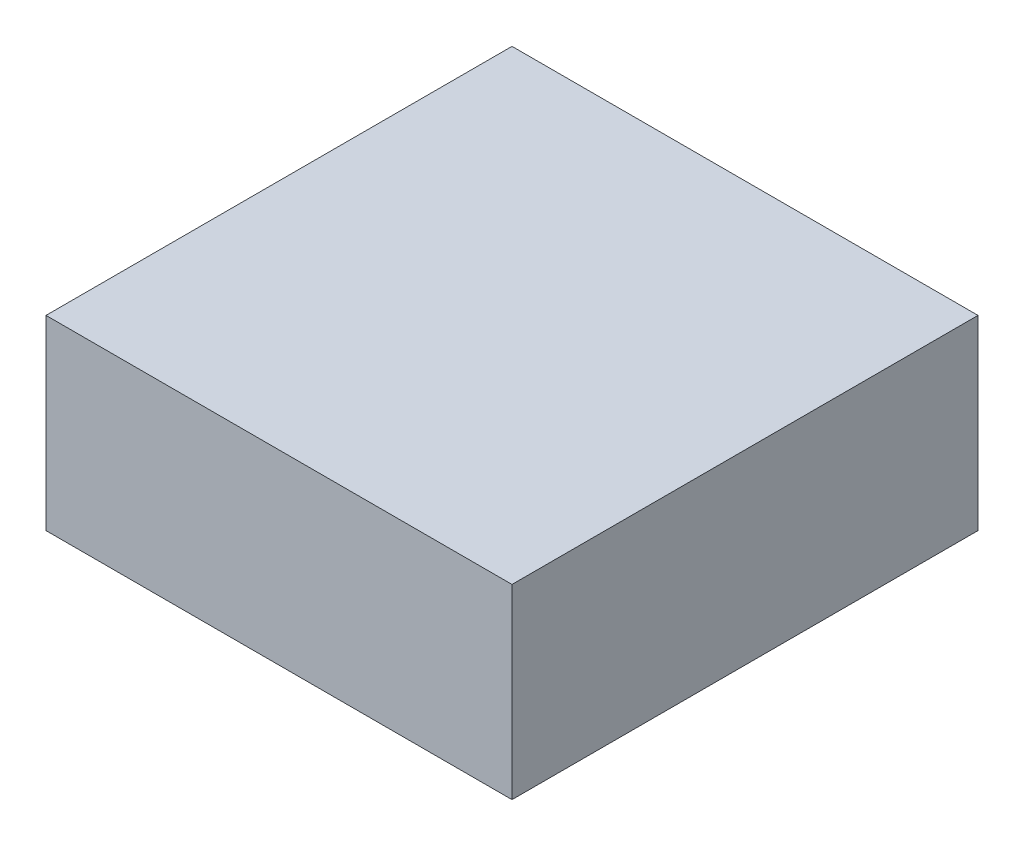
ISO-10303-21;
HEADER;
FILE_DESCRIPTION(('STEP AP214'),'2;1');
FILE_NAME('part.step','',(''),(''),'','','');
FILE_SCHEMA(('AUTOMOTIVE_DESIGN { 1 0 10303 214 1 1 1 1 }'));
ENDSEC;
DATA;
#1=APPLICATION_CONTEXT('core data for automotive mechanical design processes');
#2=APPLICATION_PROTOCOL_DEFINITION('international standard','automotive_design',2000,#1);
#3=PRODUCT_CONTEXT('',#1,'mechanical');
#4=PRODUCT('Part','Part','',(#3));
#5=PRODUCT_RELATED_PRODUCT_CATEGORY('part','',(#4));
#6=PRODUCT_DEFINITION_FORMATION('','',#4);
#7=PRODUCT_DEFINITION_CONTEXT('part definition',#1,'design');
#8=PRODUCT_DEFINITION('design','',#6,#7);
#9=PRODUCT_DEFINITION_SHAPE('','',#8);
#10=(LENGTH_UNIT() NAMED_UNIT(*) SI_UNIT(.MILLI.,.METRE.));
#11=(NAMED_UNIT(*) PLANE_ANGLE_UNIT() SI_UNIT($,.RADIAN.));
#12=(NAMED_UNIT(*) SI_UNIT($,.STERADIAN.) SOLID_ANGLE_UNIT());
#13=UNCERTAINTY_MEASURE_WITH_UNIT(LENGTH_MEASURE(1.E-05),#10,'distance_accuracy_value','');
#14=(GEOMETRIC_REPRESENTATION_CONTEXT(3) GLOBAL_UNCERTAINTY_ASSIGNED_CONTEXT((#13)) GLOBAL_UNIT_ASSIGNED_CONTEXT((#10,
#11,#12)) REPRESENTATION_CONTEXT('',''));
#15=CARTESIAN_POINT('',(0.,0.,0.));
#16=DIRECTION('',(0.,0.,1.));
#17=DIRECTION('',(1.,0.,0.));
#18=AXIS2_PLACEMENT_3D('',#15,#16,#17);
#19=CARTESIAN_POINT('',(0.,3.705,0.));
#20=DIRECTION('',(0.,1.,0.));
#21=DIRECTION('',(1.,0.,0.));
#22=AXIS2_PLACEMENT_3D('',#19,#20,#21);
#23=PLANE('',#22);
#24=DIRECTION('',(-1.,0.,0.));
#25=VECTOR('',#24,1.);
#26=CARTESIAN_POINT('',(0.,3.705,-5.89));
#27=LINE('',#26,#25);
#28=CARTESIAN_POINT('',(-19.32,3.705,-5.89));
#29=VERTEX_POINT('',#28);
#30=CARTESIAN_POINT('',(-20.32,3.705,-5.89));
#31=VERTEX_POINT('',#30);
#32=EDGE_CURVE('E11',#29,#31,#27,.T.);
#33=ORIENTED_EDGE('',*,*,#32,.T.);
#34=DIRECTION('',(0.,0.,1.));
#35=VECTOR('',#34,1.);
#36=CARTESIAN_POINT('',(-20.32,3.705,0.));
#37=LINE('',#36,#35);
#38=CARTESIAN_POINT('',(-20.32,3.705,-4.89));
#39=VERTEX_POINT('',#38);
#40=EDGE_CURVE('E24',#31,#39,#37,.T.);
#41=ORIENTED_EDGE('',*,*,#40,.T.);
#42=DIRECTION('',(1.,0.,0.));
#43=VECTOR('',#42,1.);
#44=CARTESIAN_POINT('',(0.,3.705,-4.89));
#45=LINE('',#44,#43);
#46=CARTESIAN_POINT('',(-19.32,3.705,-4.89));
#47=VERTEX_POINT('',#46);
#48=EDGE_CURVE('E88',#39,#47,#45,.T.);
#49=ORIENTED_EDGE('',*,*,#48,.T.);
#50=DIRECTION('',(0.,0.,-1.));
#51=VECTOR('',#50,1.);
#52=CARTESIAN_POINT('',(-19.32,3.705,0.));
#53=LINE('',#52,#51);
#54=EDGE_CURVE('E59',#47,#29,#53,.T.);
#55=ORIENTED_EDGE('',*,*,#54,.T.);
#56=EDGE_LOOP('',(#33,#41,#49,#55));
#57=FACE_BOUND('',#56,.T.);
#58=ADVANCED_FACE('F17',(#57),#23,.T.);
#59=CARTESIAN_POINT('',(-20.32,3.705,-5.89));
#60=DIRECTION('',(1.,0.,0.));
#61=DIRECTION('',(0.,1.,0.));
#62=AXIS2_PLACEMENT_3D('',#59,#60,#61);
#63=PLANE('',#62);
#64=DIRECTION('',(0.,-1.,0.));
#65=VECTOR('',#64,1.);
#66=CARTESIAN_POINT('',(-20.32,3.705,-4.89));
#67=LINE('',#66,#65);
#68=CARTESIAN_POINT('',(-20.32,3.305,-4.89));
#69=VERTEX_POINT('',#68);
#70=EDGE_CURVE('E75',#39,#69,#67,.T.);
#71=ORIENTED_EDGE('',*,*,#70,.F.);
#72=ORIENTED_EDGE('',*,*,#40,.F.);
#73=DIRECTION('',(0.,1.,0.));
#74=VECTOR('',#73,1.);
#75=CARTESIAN_POINT('',(-20.32,3.705,-5.89));
#76=LINE('',#75,#74);
#77=CARTESIAN_POINT('',(-20.32,3.305,-5.89));
#78=VERTEX_POINT('',#77);
#79=EDGE_CURVE('E84',#78,#31,#76,.T.);
#80=ORIENTED_EDGE('',*,*,#79,.F.);
#81=DIRECTION('',(0.,0.,-1.));
#82=VECTOR('',#81,1.);
#83=CARTESIAN_POINT('',(-20.32,3.305,-5.89));
#84=LINE('',#83,#82);
#85=EDGE_CURVE('E82',#69,#78,#84,.T.);
#86=ORIENTED_EDGE('',*,*,#85,.F.);
#87=EDGE_LOOP('',(#71,#72,#80,#86));
#88=FACE_BOUND('',#87,.T.);
#89=ADVANCED_FACE('F90',(#88),#63,.F.);
#90=CARTESIAN_POINT('',(-19.32,3.705,-5.89));
#91=DIRECTION('',(0.,0.,1.));
#92=DIRECTION('',(1.,0.,0.));
#93=AXIS2_PLACEMENT_3D('',#90,#91,#92);
#94=PLANE('',#93);
#95=ORIENTED_EDGE('',*,*,#79,.T.);
#96=ORIENTED_EDGE('',*,*,#32,.F.);
#97=DIRECTION('',(0.,1.,0.));
#98=VECTOR('',#97,1.);
#99=CARTESIAN_POINT('',(-19.32,3.705,-5.89));
#100=LINE('',#99,#98);
#101=CARTESIAN_POINT('',(-19.32,3.305,-5.89));
#102=VERTEX_POINT('',#101);
#103=EDGE_CURVE('E80',#102,#29,#100,.T.);
#104=ORIENTED_EDGE('',*,*,#103,.F.);
#105=DIRECTION('',(1.,0.,0.));
#106=VECTOR('',#105,1.);
#107=CARTESIAN_POINT('',(-19.32,3.305,-5.89));
#108=LINE('',#107,#106);
#109=EDGE_CURVE('E63',#78,#102,#108,.T.);
#110=ORIENTED_EDGE('',*,*,#109,.F.);
#111=EDGE_LOOP('',(#95,#96,#104,#110));
#112=FACE_BOUND('',#111,.T.);
#113=ADVANCED_FACE('F91',(#112),#94,.F.);
#114=CARTESIAN_POINT('',(-19.32,3.705,-4.89));
#115=DIRECTION('',(-1.,0.,0.));
#116=DIRECTION('',(0.,0.,1.));
#117=AXIS2_PLACEMENT_3D('',#114,#115,#116);
#118=PLANE('',#117);
#119=ORIENTED_EDGE('',*,*,#103,.T.);
#120=ORIENTED_EDGE('',*,*,#54,.F.);
#121=DIRECTION('',(0.,1.,0.));
#122=VECTOR('',#121,1.);
#123=CARTESIAN_POINT('',(-19.32,3.705,-4.89));
#124=LINE('',#123,#122);
#125=CARTESIAN_POINT('',(-19.32,3.305,-4.89));
#126=VERTEX_POINT('',#125);
#127=EDGE_CURVE('E54',#126,#47,#124,.T.);
#128=ORIENTED_EDGE('',*,*,#127,.F.);
#129=DIRECTION('',(0.,0.,1.));
#130=VECTOR('',#129,1.);
#131=CARTESIAN_POINT('',(-19.32,3.305,-4.89));
#132=LINE('',#131,#130);
#133=EDGE_CURVE('E58',#102,#126,#132,.T.);
#134=ORIENTED_EDGE('',*,*,#133,.F.);
#135=EDGE_LOOP('',(#119,#120,#128,#134));
#136=FACE_BOUND('',#135,.T.);
#137=ADVANCED_FACE('F57',(#136),#118,.F.);
#138=CARTESIAN_POINT('',(-20.32,3.705,-4.89));
#139=DIRECTION('',(0.,0.,-1.));
#140=DIRECTION('',(0.,-1.,0.));
#141=AXIS2_PLACEMENT_3D('',#138,#139,#140);
#142=PLANE('',#141);
#143=ORIENTED_EDGE('',*,*,#127,.T.);
#144=ORIENTED_EDGE('',*,*,#48,.F.);
#145=ORIENTED_EDGE('',*,*,#70,.T.);
#146=DIRECTION('',(-1.,0.,0.));
#147=VECTOR('',#146,1.);
#148=CARTESIAN_POINT('',(-20.32,3.305,-4.89));
#149=LINE('',#148,#147);
#150=EDGE_CURVE('E70',#126,#69,#149,.T.);
#151=ORIENTED_EDGE('',*,*,#150,.F.);
#152=EDGE_LOOP('',(#143,#144,#145,#151));
#153=FACE_BOUND('',#152,.T.);
#154=ADVANCED_FACE('F73',(#153),#142,.F.);
#155=CARTESIAN_POINT('',(0.,3.305,0.));
#156=DIRECTION('',(0.,1.,0.));
#157=DIRECTION('',(1.,0.,0.));
#158=AXIS2_PLACEMENT_3D('',#155,#156,#157);
#159=PLANE('',#158);
#160=ORIENTED_EDGE('',*,*,#85,.T.);
#161=ORIENTED_EDGE('',*,*,#109,.T.);
#162=ORIENTED_EDGE('',*,*,#133,.T.);
#163=ORIENTED_EDGE('',*,*,#150,.T.);
#164=EDGE_LOOP('',(#160,#161,#162,#163));
#165=FACE_BOUND('',#164,.T.);
#166=ADVANCED_FACE('F69',(#165),#159,.F.);
#167=CLOSED_SHELL('',(#58,#89,#113,#137,#154,#166));
#168=MANIFOLD_SOLID_BREP('B1',#167);
#169=ADVANCED_BREP_SHAPE_REPRESENTATION('',(#18,#168),#14);
#170=SHAPE_DEFINITION_REPRESENTATION(#9,#169);
ENDSEC;
END-ISO-10303-21;
